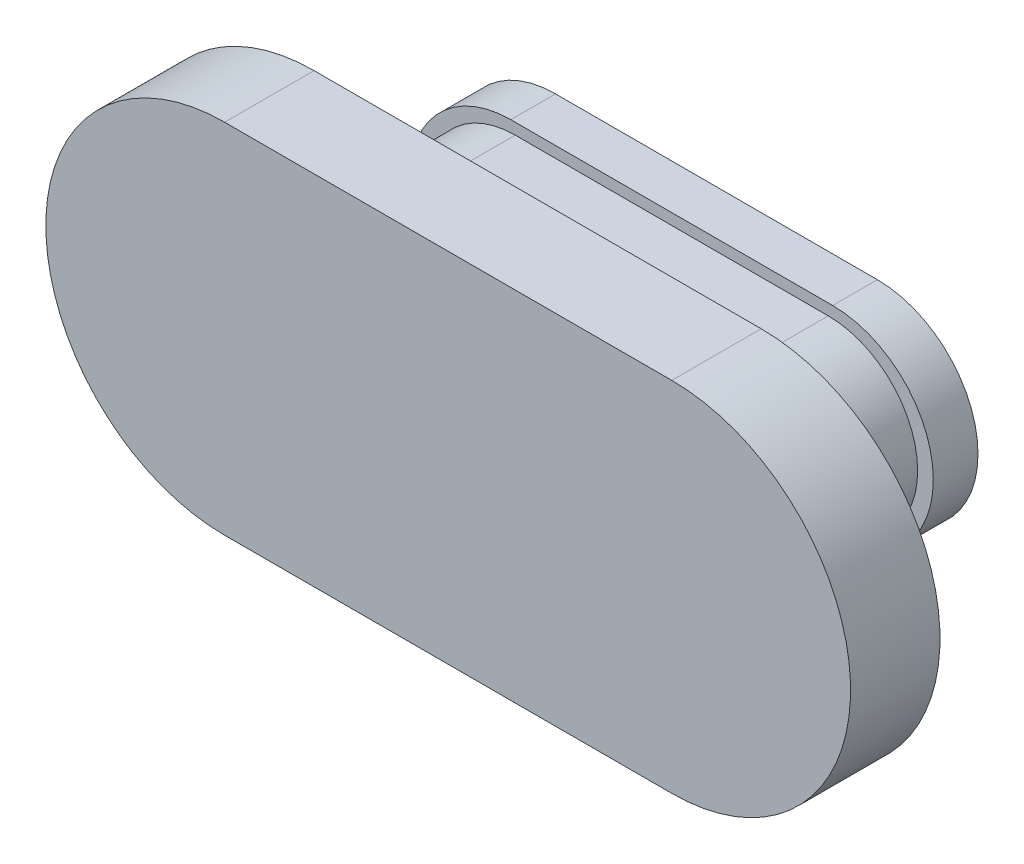
ISO-10303-21;
HEADER;
FILE_DESCRIPTION(('STEP AP214'),'2;1');
FILE_NAME('part.step','',(''),(''),'','','');
FILE_SCHEMA(('AUTOMOTIVE_DESIGN { 1 0 10303 214 1 1 1 1 }'));
ENDSEC;
DATA;
#1=APPLICATION_CONTEXT('core data for automotive mechanical design processes');
#2=APPLICATION_PROTOCOL_DEFINITION('international standard','automotive_design',2000,#1);
#3=PRODUCT_CONTEXT('',#1,'mechanical');
#4=PRODUCT('Part','Part','',(#3));
#5=PRODUCT_RELATED_PRODUCT_CATEGORY('part','',(#4));
#6=PRODUCT_DEFINITION_FORMATION('','',#4);
#7=PRODUCT_DEFINITION_CONTEXT('part definition',#1,'design');
#8=PRODUCT_DEFINITION('design','',#6,#7);
#9=PRODUCT_DEFINITION_SHAPE('','',#8);
#10=(LENGTH_UNIT() NAMED_UNIT(*) SI_UNIT(.MILLI.,.METRE.));
#11=(NAMED_UNIT(*) PLANE_ANGLE_UNIT() SI_UNIT($,.RADIAN.));
#12=(NAMED_UNIT(*) SI_UNIT($,.STERADIAN.) SOLID_ANGLE_UNIT());
#13=UNCERTAINTY_MEASURE_WITH_UNIT(LENGTH_MEASURE(1.E-05),#10,'distance_accuracy_value','');
#14=(GEOMETRIC_REPRESENTATION_CONTEXT(3) GLOBAL_UNCERTAINTY_ASSIGNED_CONTEXT((#13)) GLOBAL_UNIT_ASSIGNED_CONTEXT((#10,
#11,#12)) REPRESENTATION_CONTEXT('',''));
#15=CARTESIAN_POINT('',(0.,0.,0.));
#16=DIRECTION('',(0.,0.,1.));
#17=DIRECTION('',(1.,0.,0.));
#18=AXIS2_PLACEMENT_3D('',#15,#16,#17);
#19=CARTESIAN_POINT('',(-3.5,0.,1.5));
#20=DIRECTION('',(0.,0.,-1.));
#21=DIRECTION('',(-1.,0.,0.));
#22=AXIS2_PLACEMENT_3D('',#19,#20,#21);
#23=CYLINDRICAL_SURFACE('',#22,2.);
#24=CARTESIAN_POINT('',(-3.5,0.,-1.5));
#25=DIRECTION('',(0.,0.,1.));
#26=DIRECTION('',(1.,0.,0.));
#27=AXIS2_PLACEMENT_3D('',#24,#25,#26);
#28=CIRCLE('',#27,2.);
#29=CARTESIAN_POINT('',(-3.5,2.,-1.5));
#30=VERTEX_POINT('',#29);
#31=CARTESIAN_POINT('',(-3.5,-2.,-1.5));
#32=VERTEX_POINT('',#31);
#33=EDGE_CURVE('E170',#30,#32,#28,.T.);
#34=ORIENTED_EDGE('',*,*,#33,.T.);
#35=DIRECTION('',(0.,0.,-1.));
#36=VECTOR('',#35,1.);
#37=CARTESIAN_POINT('',(-3.5,-2.,1.5));
#38=LINE('',#37,#36);
#39=CARTESIAN_POINT('',(-3.5,-2.,1.5));
#40=VERTEX_POINT('',#39);
#41=EDGE_CURVE('E11',#40,#32,#38,.T.);
#42=ORIENTED_EDGE('',*,*,#41,.F.);
#43=CARTESIAN_POINT('',(-3.5,0.,1.5));
#44=DIRECTION('',(0.,0.,1.));
#45=DIRECTION('',(1.,0.,0.));
#46=AXIS2_PLACEMENT_3D('',#43,#44,#45);
#47=CIRCLE('',#46,2.);
#48=CARTESIAN_POINT('',(-3.5,2.,1.5));
#49=VERTEX_POINT('',#48);
#50=EDGE_CURVE('E178',#49,#40,#47,.T.);
#51=ORIENTED_EDGE('',*,*,#50,.F.);
#52=DIRECTION('',(0.,0.,-1.));
#53=VECTOR('',#52,1.);
#54=CARTESIAN_POINT('',(-3.5,2.,1.5));
#55=LINE('',#54,#53);
#56=EDGE_CURVE('E191',#49,#30,#55,.T.);
#57=ORIENTED_EDGE('',*,*,#56,.T.);
#58=EDGE_LOOP('',(#34,#42,#51,#57));
#59=FACE_BOUND('',#58,.T.);
#60=ADVANCED_FACE('F33',(#59),#23,.T.);
#61=CARTESIAN_POINT('',(-3.5,-2.,1.5));
#62=DIRECTION('',(0.,1.,0.));
#63=DIRECTION('',(-1.,0.,0.));
#64=AXIS2_PLACEMENT_3D('',#61,#62,#63);
#65=PLANE('',#64);
#66=DIRECTION('',(1.,0.,0.));
#67=VECTOR('',#66,1.);
#68=CARTESIAN_POINT('',(-3.5,-2.,-1.5));
#69=LINE('',#68,#67);
#70=CARTESIAN_POINT('',(3.5,-2.,-1.5));
#71=VERTEX_POINT('',#70);
#72=EDGE_CURVE('E194',#32,#71,#69,.T.);
#73=ORIENTED_EDGE('',*,*,#72,.T.);
#74=DIRECTION('',(0.,0.,-1.));
#75=VECTOR('',#74,1.);
#76=CARTESIAN_POINT('',(3.5,-2.,1.5));
#77=LINE('',#76,#75);
#78=CARTESIAN_POINT('',(3.5,-2.,1.5));
#79=VERTEX_POINT('',#78);
#80=EDGE_CURVE('E41',#79,#71,#77,.T.);
#81=ORIENTED_EDGE('',*,*,#80,.F.);
#82=DIRECTION('',(1.,0.,0.));
#83=VECTOR('',#82,1.);
#84=CARTESIAN_POINT('',(-3.5,-2.,1.5));
#85=LINE('',#84,#83);
#86=EDGE_CURVE('E181',#40,#79,#85,.T.);
#87=ORIENTED_EDGE('',*,*,#86,.F.);
#88=ORIENTED_EDGE('',*,*,#41,.T.);
#89=EDGE_LOOP('',(#73,#81,#87,#88));
#90=FACE_BOUND('',#89,.T.);
#91=ADVANCED_FACE('F207',(#90),#65,.F.);
#92=CARTESIAN_POINT('',(3.5,0.,1.5));
#93=DIRECTION('',(0.,0.,-1.));
#94=DIRECTION('',(-1.,0.,0.));
#95=AXIS2_PLACEMENT_3D('',#92,#93,#94);
#96=CYLINDRICAL_SURFACE('',#95,2.);
#97=CARTESIAN_POINT('',(3.5,0.,-1.5));
#98=DIRECTION('',(0.,0.,1.));
#99=DIRECTION('',(1.,0.,0.));
#100=AXIS2_PLACEMENT_3D('',#97,#98,#99);
#101=CIRCLE('',#100,2.);
#102=CARTESIAN_POINT('',(3.5,2.,-1.5));
#103=VERTEX_POINT('',#102);
#104=EDGE_CURVE('E197',#71,#103,#101,.T.);
#105=ORIENTED_EDGE('',*,*,#104,.T.);
#106=DIRECTION('',(0.,0.,-1.));
#107=VECTOR('',#106,1.);
#108=CARTESIAN_POINT('',(3.5,2.,1.5));
#109=LINE('',#108,#107);
#110=CARTESIAN_POINT('',(3.5,2.,1.5));
#111=VERTEX_POINT('',#110);
#112=EDGE_CURVE('E48',#111,#103,#109,.T.);
#113=ORIENTED_EDGE('',*,*,#112,.F.);
#114=CARTESIAN_POINT('',(3.5,0.,1.5));
#115=DIRECTION('',(0.,0.,1.));
#116=DIRECTION('',(1.,0.,0.));
#117=AXIS2_PLACEMENT_3D('',#114,#115,#116);
#118=CIRCLE('',#117,2.);
#119=EDGE_CURVE('E185',#79,#111,#118,.T.);
#120=ORIENTED_EDGE('',*,*,#119,.F.);
#121=ORIENTED_EDGE('',*,*,#80,.T.);
#122=EDGE_LOOP('',(#105,#113,#120,#121));
#123=FACE_BOUND('',#122,.T.);
#124=ADVANCED_FACE('F204',(#123),#96,.T.);
#125=CARTESIAN_POINT('',(-3.5,2.,1.5));
#126=DIRECTION('',(0.,-1.,0.));
#127=DIRECTION('',(1.,0.,0.));
#128=AXIS2_PLACEMENT_3D('',#125,#126,#127);
#129=PLANE('',#128);
#130=DIRECTION('',(-1.,0.,0.));
#131=VECTOR('',#130,1.);
#132=CARTESIAN_POINT('',(-3.5,2.,-1.5));
#133=LINE('',#132,#131);
#134=EDGE_CURVE('E182',#103,#30,#133,.T.);
#135=ORIENTED_EDGE('',*,*,#134,.T.);
#136=ORIENTED_EDGE('',*,*,#56,.F.);
#137=DIRECTION('',(-1.,0.,0.));
#138=VECTOR('',#137,1.);
#139=CARTESIAN_POINT('',(-3.5,2.,1.5));
#140=LINE('',#139,#138);
#141=EDGE_CURVE('E188',#111,#49,#140,.T.);
#142=ORIENTED_EDGE('',*,*,#141,.F.);
#143=ORIENTED_EDGE('',*,*,#112,.T.);
#144=EDGE_LOOP('',(#135,#136,#142,#143));
#145=FACE_BOUND('',#144,.T.);
#146=ADVANCED_FACE('F214',(#145),#129,.F.);
#147=CARTESIAN_POINT('',(-5.,0.,1.5));
#148=DIRECTION('',(0.,0.,1.));
#149=DIRECTION('',(1.,0.,0.));
#150=AXIS2_PLACEMENT_3D('',#147,#148,#149);
#151=PLANE('',#150);
#152=DIRECTION('',(-1.,0.,0.));
#153=VECTOR('',#152,1.);
#154=CARTESIAN_POINT('',(-3.5,-4.,1.5));
#155=LINE('',#154,#153);
#156=CARTESIAN_POINT('',(5.,-4.,1.5));
#157=VERTEX_POINT('',#156);
#158=CARTESIAN_POINT('',(-5.,-4.,1.5));
#159=VERTEX_POINT('',#158);
#160=EDGE_CURVE('E143',#157,#159,#155,.T.);
#161=ORIENTED_EDGE('',*,*,#160,.T.);
#162=CARTESIAN_POINT('',(-5.,0.,1.5));
#163=DIRECTION('',(0.,0.,1.));
#164=DIRECTION('',(1.,0.,0.));
#165=AXIS2_PLACEMENT_3D('',#162,#163,#164);
#166=CIRCLE('',#165,4.);
#167=CARTESIAN_POINT('',(-5.,4.,1.5));
#168=VERTEX_POINT('',#167);
#169=EDGE_CURVE('E146',#168,#159,#166,.T.);
#170=ORIENTED_EDGE('',*,*,#169,.F.);
#171=DIRECTION('',(-1.,0.,0.));
#172=VECTOR('',#171,1.);
#173=CARTESIAN_POINT('',(-3.5,4.,1.5));
#174=LINE('',#173,#172);
#175=CARTESIAN_POINT('',(5.,4.,1.5));
#176=VERTEX_POINT('',#175);
#177=EDGE_CURVE('E165',#176,#168,#174,.T.);
#178=ORIENTED_EDGE('',*,*,#177,.F.);
#179=CARTESIAN_POINT('',(5.,0.,1.5));
#180=DIRECTION('',(0.,0.,1.));
#181=DIRECTION('',(1.,0.,0.));
#182=AXIS2_PLACEMENT_3D('',#179,#180,#181);
#183=CIRCLE('',#182,4.);
#184=EDGE_CURVE('E156',#157,#176,#183,.T.);
#185=ORIENTED_EDGE('',*,*,#184,.F.);
#186=EDGE_LOOP('',(#161,#170,#178,#185));
#187=FACE_BOUND('',#186,.T.);
#188=ORIENTED_EDGE('',*,*,#141,.T.);
#189=ORIENTED_EDGE('',*,*,#50,.T.);
#190=ORIENTED_EDGE('',*,*,#86,.T.);
#191=ORIENTED_EDGE('',*,*,#119,.T.);
#192=EDGE_LOOP('',(#188,#189,#190,#191));
#193=FACE_BOUND('',#192,.T.);
#194=ADVANCED_FACE('F217',(#187,#193),#151,.F.);
#195=CARTESIAN_POINT('',(-3.5,-4.,3.5));
#196=DIRECTION('',(0.,-1.,0.));
#197=DIRECTION('',(1.,0.,0.));
#198=AXIS2_PLACEMENT_3D('',#195,#196,#197);
#199=PLANE('',#198);
#200=ORIENTED_EDGE('',*,*,#160,.F.);
#201=DIRECTION('',(0.,0.,-1.));
#202=VECTOR('',#201,1.);
#203=CARTESIAN_POINT('',(5.,-4.,3.5));
#204=LINE('',#203,#202);
#205=CARTESIAN_POINT('',(5.,-4.,3.5));
#206=VERTEX_POINT('',#205);
#207=EDGE_CURVE('E168',#206,#157,#204,.T.);
#208=ORIENTED_EDGE('',*,*,#207,.F.);
#209=DIRECTION('',(-1.,0.,0.));
#210=VECTOR('',#209,1.);
#211=CARTESIAN_POINT('',(-3.5,-4.,3.5));
#212=LINE('',#211,#210);
#213=CARTESIAN_POINT('',(-5.,-4.,3.5));
#214=VERTEX_POINT('',#213);
#215=EDGE_CURVE('E152',#206,#214,#212,.T.);
#216=ORIENTED_EDGE('',*,*,#215,.T.);
#217=DIRECTION('',(0.,0.,-1.));
#218=VECTOR('',#217,1.);
#219=CARTESIAN_POINT('',(-5.,-4.,3.5));
#220=LINE('',#219,#218);
#221=EDGE_CURVE('E161',#214,#159,#220,.T.);
#222=ORIENTED_EDGE('',*,*,#221,.T.);
#223=EDGE_LOOP('',(#200,#208,#216,#222));
#224=FACE_BOUND('',#223,.T.);
#225=ADVANCED_FACE('F219',(#224),#199,.T.);
#226=CARTESIAN_POINT('',(5.,0.,3.5));
#227=DIRECTION('',(0.,0.,-1.));
#228=DIRECTION('',(-1.,0.,0.));
#229=AXIS2_PLACEMENT_3D('',#226,#227,#228);
#230=CYLINDRICAL_SURFACE('',#229,4.);
#231=ORIENTED_EDGE('',*,*,#184,.T.);
#232=DIRECTION('',(0.,0.,-1.));
#233=VECTOR('',#232,1.);
#234=CARTESIAN_POINT('',(5.,4.,3.5));
#235=LINE('',#234,#233);
#236=CARTESIAN_POINT('',(5.,4.,3.5));
#237=VERTEX_POINT('',#236);
#238=EDGE_CURVE('E171',#237,#176,#235,.T.);
#239=ORIENTED_EDGE('',*,*,#238,.F.);
#240=CARTESIAN_POINT('',(5.,0.,3.5));
#241=DIRECTION('',(0.,0.,1.));
#242=DIRECTION('',(1.,0.,0.));
#243=AXIS2_PLACEMENT_3D('',#240,#241,#242);
#244=CIRCLE('',#243,4.);
#245=EDGE_CURVE('E160',#206,#237,#244,.T.);
#246=ORIENTED_EDGE('',*,*,#245,.F.);
#247=ORIENTED_EDGE('',*,*,#207,.T.);
#248=EDGE_LOOP('',(#231,#239,#246,#247));
#249=FACE_BOUND('',#248,.T.);
#250=ADVANCED_FACE('F226',(#249),#230,.T.);
#251=CARTESIAN_POINT('',(-3.5,4.,3.5));
#252=DIRECTION('',(0.,-1.,0.));
#253=DIRECTION('',(1.,0.,0.));
#254=AXIS2_PLACEMENT_3D('',#251,#252,#253);
#255=PLANE('',#254);
#256=ORIENTED_EDGE('',*,*,#177,.T.);
#257=DIRECTION('',(0.,0.,-1.));
#258=VECTOR('',#257,1.);
#259=CARTESIAN_POINT('',(-5.,4.,3.5));
#260=LINE('',#259,#258);
#261=CARTESIAN_POINT('',(-5.,4.,3.5));
#262=VERTEX_POINT('',#261);
#263=EDGE_CURVE('E174',#262,#168,#260,.T.);
#264=ORIENTED_EDGE('',*,*,#263,.F.);
#265=DIRECTION('',(-1.,0.,0.));
#266=VECTOR('',#265,1.);
#267=CARTESIAN_POINT('',(-3.5,4.,3.5));
#268=LINE('',#267,#266);
#269=EDGE_CURVE('E158',#237,#262,#268,.T.);
#270=ORIENTED_EDGE('',*,*,#269,.F.);
#271=ORIENTED_EDGE('',*,*,#238,.T.);
#272=EDGE_LOOP('',(#256,#264,#270,#271));
#273=FACE_BOUND('',#272,.T.);
#274=ADVANCED_FACE('F247',(#273),#255,.F.);
#275=CARTESIAN_POINT('',(-5.,0.,3.5));
#276=DIRECTION('',(0.,0.,-1.));
#277=DIRECTION('',(-1.,0.,0.));
#278=AXIS2_PLACEMENT_3D('',#275,#276,#277);
#279=CYLINDRICAL_SURFACE('',#278,4.);
#280=ORIENTED_EDGE('',*,*,#169,.T.);
#281=ORIENTED_EDGE('',*,*,#221,.F.);
#282=CARTESIAN_POINT('',(-5.,0.,3.5));
#283=DIRECTION('',(0.,0.,1.));
#284=DIRECTION('',(1.,0.,0.));
#285=AXIS2_PLACEMENT_3D('',#282,#283,#284);
#286=CIRCLE('',#285,4.);
#287=EDGE_CURVE('E155',#262,#214,#286,.T.);
#288=ORIENTED_EDGE('',*,*,#287,.F.);
#289=ORIENTED_EDGE('',*,*,#263,.T.);
#290=EDGE_LOOP('',(#280,#281,#288,#289));
#291=FACE_BOUND('',#290,.T.);
#292=ADVANCED_FACE('F243',(#291),#279,.T.);
#293=CARTESIAN_POINT('',(-5.,0.,3.5));
#294=DIRECTION('',(0.,0.,1.));
#295=DIRECTION('',(1.,0.,0.));
#296=AXIS2_PLACEMENT_3D('',#293,#294,#295);
#297=PLANE('',#296);
#298=ORIENTED_EDGE('',*,*,#215,.F.);
#299=ORIENTED_EDGE('',*,*,#245,.T.);
#300=ORIENTED_EDGE('',*,*,#269,.T.);
#301=ORIENTED_EDGE('',*,*,#287,.T.);
#302=EDGE_LOOP('',(#298,#299,#300,#301));
#303=FACE_BOUND('',#302,.T.);
#304=ADVANCED_FACE('F246',(#303),#297,.T.);
#305=CARTESIAN_POINT('',(3.6,0.,-2.5));
#306=DIRECTION('',(0.,0.,1.));
#307=DIRECTION('',(1.,0.,0.));
#308=AXIS2_PLACEMENT_3D('',#305,#306,#307);
#309=CYLINDRICAL_SURFACE('',#308,2.25);
#310=CARTESIAN_POINT('',(3.6,0.,-1.5));
#311=DIRECTION('',(0.,0.,-1.));
#312=DIRECTION('',(-1.,0.,0.));
#313=AXIS2_PLACEMENT_3D('',#310,#311,#312);
#314=CIRCLE('',#313,2.25);
#315=CARTESIAN_POINT('',(3.6,2.25,-1.5));
#316=VERTEX_POINT('',#315);
#317=CARTESIAN_POINT('',(3.6,-2.25,-1.5));
#318=VERTEX_POINT('',#317);
#319=EDGE_CURVE('E142',#316,#318,#314,.T.);
#320=ORIENTED_EDGE('',*,*,#319,.T.);
#321=DIRECTION('',(0.,0.,1.));
#322=VECTOR('',#321,1.);
#323=CARTESIAN_POINT('',(3.6,-2.25,-2.5));
#324=LINE('',#323,#322);
#325=CARTESIAN_POINT('',(3.6,-2.25,-2.5));
#326=VERTEX_POINT('',#325);
#327=EDGE_CURVE('E122',#326,#318,#324,.T.);
#328=ORIENTED_EDGE('',*,*,#327,.F.);
#329=CARTESIAN_POINT('',(3.6,0.,-2.5));
#330=DIRECTION('',(0.,0.,-1.));
#331=DIRECTION('',(-1.,0.,0.));
#332=AXIS2_PLACEMENT_3D('',#329,#330,#331);
#333=CIRCLE('',#332,2.25);
#334=CARTESIAN_POINT('',(3.6,2.25,-2.5));
#335=VERTEX_POINT('',#334);
#336=EDGE_CURVE('E129',#335,#326,#333,.T.);
#337=ORIENTED_EDGE('',*,*,#336,.F.);
#338=DIRECTION('',(0.,0.,1.));
#339=VECTOR('',#338,1.);
#340=CARTESIAN_POINT('',(3.6,2.25,-2.5));
#341=LINE('',#340,#339);
#342=EDGE_CURVE('E372',#335,#316,#341,.T.);
#343=ORIENTED_EDGE('',*,*,#342,.T.);
#344=EDGE_LOOP('',(#320,#328,#337,#343));
#345=FACE_BOUND('',#344,.T.);
#346=ADVANCED_FACE('F140',(#345),#309,.T.);
#347=CARTESIAN_POINT('',(3.6,-2.25,-2.5));
#348=DIRECTION('',(0.,1.,0.));
#349=DIRECTION('',(-1.,0.,0.));
#350=AXIS2_PLACEMENT_3D('',#347,#348,#349);
#351=PLANE('',#350);
#352=DIRECTION('',(-1.,0.,0.));
#353=VECTOR('',#352,1.);
#354=CARTESIAN_POINT('',(3.6,-2.25,-1.5));
#355=LINE('',#354,#353);
#356=CARTESIAN_POINT('',(-3.6,-2.25,-1.5));
#357=VERTEX_POINT('',#356);
#358=EDGE_CURVE('E378',#318,#357,#355,.T.);
#359=ORIENTED_EDGE('',*,*,#358,.T.);
#360=DIRECTION('',(0.,0.,1.));
#361=VECTOR('',#360,1.);
#362=CARTESIAN_POINT('',(-3.6,-2.25,-2.5));
#363=LINE('',#362,#361);
#364=CARTESIAN_POINT('',(-3.6,-2.25,-2.5));
#365=VERTEX_POINT('',#364);
#366=EDGE_CURVE('E125',#365,#357,#363,.T.);
#367=ORIENTED_EDGE('',*,*,#366,.F.);
#368=DIRECTION('',(-1.,0.,0.));
#369=VECTOR('',#368,1.);
#370=CARTESIAN_POINT('',(3.6,-2.25,-2.5));
#371=LINE('',#370,#369);
#372=EDGE_CURVE('E118',#326,#365,#371,.T.);
#373=ORIENTED_EDGE('',*,*,#372,.F.);
#374=ORIENTED_EDGE('',*,*,#327,.T.);
#375=EDGE_LOOP('',(#359,#367,#373,#374));
#376=FACE_BOUND('',#375,.T.);
#377=ADVANCED_FACE('F120',(#376),#351,.F.);
#378=CARTESIAN_POINT('',(-3.6,0.,-2.5));
#379=DIRECTION('',(0.,0.,1.));
#380=DIRECTION('',(1.,0.,0.));
#381=AXIS2_PLACEMENT_3D('',#378,#379,#380);
#382=CYLINDRICAL_SURFACE('',#381,2.25);
#383=CARTESIAN_POINT('',(-3.6,0.,-1.5));
#384=DIRECTION('',(0.,0.,-1.));
#385=DIRECTION('',(-1.,0.,0.));
#386=AXIS2_PLACEMENT_3D('',#383,#384,#385);
#387=CIRCLE('',#386,2.25);
#388=CARTESIAN_POINT('',(-3.6,2.25,-1.5));
#389=VERTEX_POINT('',#388);
#390=EDGE_CURVE('E375',#357,#389,#387,.T.);
#391=ORIENTED_EDGE('',*,*,#390,.T.);
#392=DIRECTION('',(0.,0.,1.));
#393=VECTOR('',#392,1.);
#394=CARTESIAN_POINT('',(-3.6,2.25,-2.5));
#395=LINE('',#394,#393);
#396=CARTESIAN_POINT('',(-3.6,2.25,-2.5));
#397=VERTEX_POINT('',#396);
#398=EDGE_CURVE('E148',#397,#389,#395,.T.);
#399=ORIENTED_EDGE('',*,*,#398,.F.);
#400=CARTESIAN_POINT('',(-3.6,0.,-2.5));
#401=DIRECTION('',(0.,0.,-1.));
#402=DIRECTION('',(-1.,0.,0.));
#403=AXIS2_PLACEMENT_3D('',#400,#401,#402);
#404=CIRCLE('',#403,2.25);
#405=EDGE_CURVE('E128',#365,#397,#404,.T.);
#406=ORIENTED_EDGE('',*,*,#405,.F.);
#407=ORIENTED_EDGE('',*,*,#366,.T.);
#408=EDGE_LOOP('',(#391,#399,#406,#407));
#409=FACE_BOUND('',#408,.T.);
#410=ADVANCED_FACE('F274',(#409),#382,.T.);
#411=CARTESIAN_POINT('',(3.6,2.25,-2.5));
#412=DIRECTION('',(0.,-1.,0.));
#413=DIRECTION('',(1.,0.,0.));
#414=AXIS2_PLACEMENT_3D('',#411,#412,#413);
#415=PLANE('',#414);
#416=DIRECTION('',(1.,0.,0.));
#417=VECTOR('',#416,1.);
#418=CARTESIAN_POINT('',(3.6,2.25,-1.5));
#419=LINE('',#418,#417);
#420=EDGE_CURVE('E138',#389,#316,#419,.T.);
#421=ORIENTED_EDGE('',*,*,#420,.T.);
#422=ORIENTED_EDGE('',*,*,#342,.F.);
#423=DIRECTION('',(1.,0.,0.));
#424=VECTOR('',#423,1.);
#425=CARTESIAN_POINT('',(3.6,2.25,-2.5));
#426=LINE('',#425,#424);
#427=EDGE_CURVE('E134',#397,#335,#426,.T.);
#428=ORIENTED_EDGE('',*,*,#427,.F.);
#429=ORIENTED_EDGE('',*,*,#398,.T.);
#430=EDGE_LOOP('',(#421,#422,#428,#429));
#431=FACE_BOUND('',#430,.T.);
#432=ADVANCED_FACE('F277',(#431),#415,.F.);
#433=CARTESIAN_POINT('',(3.6,0.,-2.5));
#434=DIRECTION('',(0.,0.,-1.));
#435=DIRECTION('',(-1.,0.,0.));
#436=AXIS2_PLACEMENT_3D('',#433,#434,#435);
#437=PLANE('',#436);
#438=ORIENTED_EDGE('',*,*,#336,.T.);
#439=ORIENTED_EDGE('',*,*,#372,.T.);
#440=ORIENTED_EDGE('',*,*,#405,.T.);
#441=ORIENTED_EDGE('',*,*,#427,.T.);
#442=EDGE_LOOP('',(#438,#439,#440,#441));
#443=FACE_BOUND('',#442,.T.);
#444=ADVANCED_FACE('F132',(#443),#437,.T.);
#445=CARTESIAN_POINT('',(3.6,0.,-1.5));
#446=DIRECTION('',(0.,0.,-1.));
#447=DIRECTION('',(-1.,0.,0.));
#448=AXIS2_PLACEMENT_3D('',#445,#446,#447);
#449=PLANE('',#448);
#450=ORIENTED_EDGE('',*,*,#33,.F.);
#451=ORIENTED_EDGE('',*,*,#134,.F.);
#452=ORIENTED_EDGE('',*,*,#104,.F.);
#453=ORIENTED_EDGE('',*,*,#72,.F.);
#454=EDGE_LOOP('',(#450,#451,#452,#453));
#455=FACE_BOUND('',#454,.T.);
#456=ORIENTED_EDGE('',*,*,#319,.F.);
#457=ORIENTED_EDGE('',*,*,#420,.F.);
#458=ORIENTED_EDGE('',*,*,#390,.F.);
#459=ORIENTED_EDGE('',*,*,#358,.F.);
#460=EDGE_LOOP('',(#456,#457,#458,#459));
#461=FACE_BOUND('',#460,.T.);
#462=ADVANCED_FACE('F210',(#455,#461),#449,.F.);
#463=CLOSED_SHELL('',(#60,#91,#124,#146,#194,#225,#250,#274,#292,#304,#346,#377,#410,#432,#444,#462));
#464=MANIFOLD_SOLID_BREP('B2',#463);
#465=ADVANCED_BREP_SHAPE_REPRESENTATION('',(#18,#464),#14);
#466=SHAPE_DEFINITION_REPRESENTATION(#9,#465);
ENDSEC;
END-ISO-10303-21;
